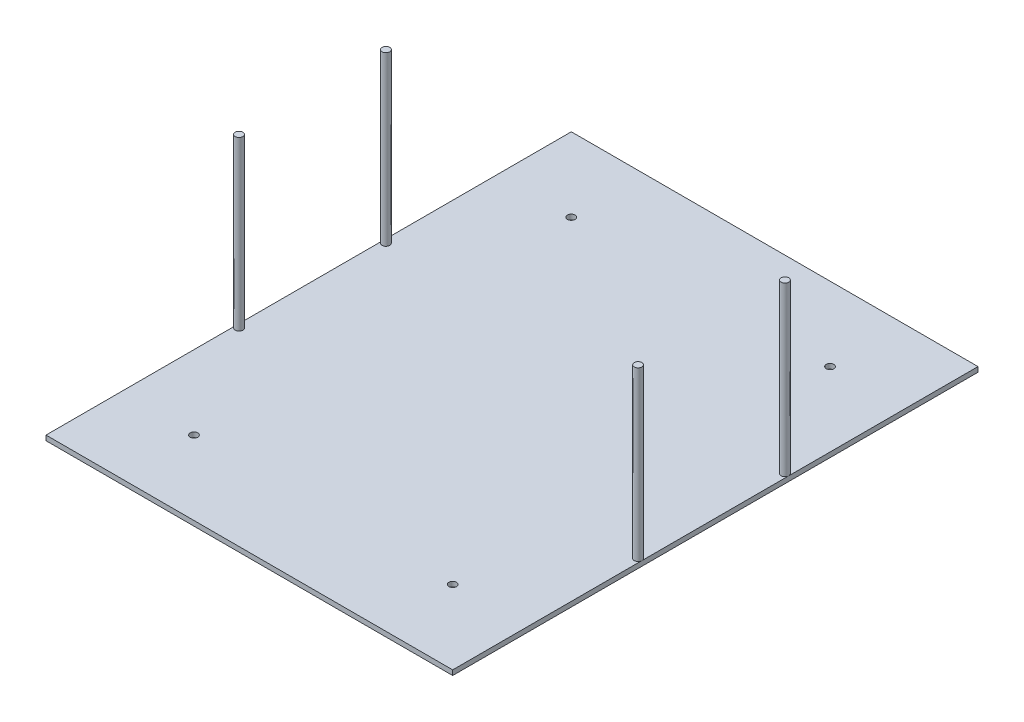
ISO-10303-21;
HEADER;
FILE_DESCRIPTION(('STEP AP214'),'2;1');
FILE_NAME('part.step','',(''),(''),'','','');
FILE_SCHEMA(('AUTOMOTIVE_DESIGN { 1 0 10303 214 1 1 1 1 }'));
ENDSEC;
DATA;
#1=APPLICATION_CONTEXT('core data for automotive mechanical design processes');
#2=APPLICATION_PROTOCOL_DEFINITION('international standard','automotive_design',2000,#1);
#3=PRODUCT_CONTEXT('',#1,'mechanical');
#4=PRODUCT('Part','Part','',(#3));
#5=PRODUCT_RELATED_PRODUCT_CATEGORY('part','',(#4));
#6=PRODUCT_DEFINITION_FORMATION('','',#4);
#7=PRODUCT_DEFINITION_CONTEXT('part definition',#1,'design');
#8=PRODUCT_DEFINITION('design','',#6,#7);
#9=PRODUCT_DEFINITION_SHAPE('','',#8);
#10=(LENGTH_UNIT() NAMED_UNIT(*) SI_UNIT(.MILLI.,.METRE.));
#11=(NAMED_UNIT(*) PLANE_ANGLE_UNIT() SI_UNIT($,.RADIAN.));
#12=(NAMED_UNIT(*) SI_UNIT($,.STERADIAN.) SOLID_ANGLE_UNIT());
#13=UNCERTAINTY_MEASURE_WITH_UNIT(LENGTH_MEASURE(1.E-05),#10,'distance_accuracy_value','');
#14=(GEOMETRIC_REPRESENTATION_CONTEXT(3) GLOBAL_UNCERTAINTY_ASSIGNED_CONTEXT((#13)) GLOBAL_UNIT_ASSIGNED_CONTEXT((#10,
#11,#12)) REPRESENTATION_CONTEXT('',''));
#15=CARTESIAN_POINT('',(0.,0.,0.));
#16=DIRECTION('',(0.,0.,1.));
#17=DIRECTION('',(1.,0.,0.));
#18=AXIS2_PLACEMENT_3D('',#15,#16,#17);
#19=CARTESIAN_POINT('',(-80.9,70.,-29.78));
#20=DIRECTION('',(0.,-1.,0.));
#21=DIRECTION('',(0.,0.,-1.));
#22=AXIS2_PLACEMENT_3D('',#19,#20,#21);
#23=CYLINDRICAL_SURFACE('',#22,1.54999999999999);
#24=CARTESIAN_POINT('',(-80.9,70.,-29.78));
#25=DIRECTION('',(0.,1.,0.));
#26=DIRECTION('',(0.,0.,1.));
#27=AXIS2_PLACEMENT_3D('',#24,#25,#26);
#28=CIRCLE('',#27,1.54999999999999);
#29=CARTESIAN_POINT('',(-80.9,70.,-28.23));
#30=VERTEX_POINT('',#29);
#31=EDGE_CURVE('E47',#30,#30,#28,.T.);
#32=ORIENTED_EDGE('',*,*,#31,.F.);
#33=EDGE_LOOP('',(#32));
#34=FACE_BOUND('',#33,.T.);
#35=CARTESIAN_POINT('',(-80.9,2.,-29.78));
#36=DIRECTION('',(0.,-1.,0.));
#37=DIRECTION('',(0.,0.,-1.));
#38=AXIS2_PLACEMENT_3D('',#35,#36,#37);
#39=CIRCLE('',#38,1.54999999999999);
#40=CARTESIAN_POINT('',(-82.45,2.,-29.78));
#41=VERTEX_POINT('',#40);
#42=EDGE_CURVE('E11',#41,#41,#39,.T.);
#43=ORIENTED_EDGE('',*,*,#42,.F.);
#44=EDGE_LOOP('',(#43));
#45=FACE_BOUND('',#44,.T.);
#46=ADVANCED_FACE('F38',(#34,#45),#23,.T.);
#47=CARTESIAN_POINT('',(-80.9,70.,-29.78));
#48=DIRECTION('',(0.,1.,0.));
#49=DIRECTION('',(0.,0.,1.));
#50=AXIS2_PLACEMENT_3D('',#47,#48,#49);
#51=PLANE('',#50);
#52=ORIENTED_EDGE('',*,*,#31,.T.);
#53=EDGE_LOOP('',(#52));
#54=FACE_BOUND('',#53,.T.);
#55=ADVANCED_FACE('F226',(#54),#51,.T.);
#56=CARTESIAN_POINT('',(-82.45,2.,106.5));
#57=DIRECTION('',(1.,0.,0.));
#58=DIRECTION('',(0.,0.,-1.));
#59=AXIS2_PLACEMENT_3D('',#56,#57,#58);
#60=PLANE('',#59);
#61=DIRECTION('',(0.,0.,1.));
#62=VECTOR('',#61,1.);
#63=CARTESIAN_POINT('',(-82.45,0.,106.5));
#64=LINE('',#63,#62);
#65=CARTESIAN_POINT('',(-82.45,0.,-106.5));
#66=VERTEX_POINT('',#65);
#67=CARTESIAN_POINT('',(-82.45,0.,106.5));
#68=VERTEX_POINT('',#67);
#69=EDGE_CURVE('E134',#66,#68,#64,.T.);
#70=ORIENTED_EDGE('',*,*,#69,.T.);
#71=DIRECTION('',(0.,-1.,0.));
#72=VECTOR('',#71,1.);
#73=CARTESIAN_POINT('',(-82.45,2.,106.5));
#74=LINE('',#73,#72);
#75=CARTESIAN_POINT('',(-82.45,2.,106.5));
#76=VERTEX_POINT('',#75);
#77=EDGE_CURVE('E141',#76,#68,#74,.T.);
#78=ORIENTED_EDGE('',*,*,#77,.F.);
#79=DIRECTION('',(0.,0.,1.));
#80=VECTOR('',#79,1.);
#81=CARTESIAN_POINT('',(-82.45,2.,106.5));
#82=LINE('',#81,#80);
#83=CARTESIAN_POINT('',(-82.45,2.,29.78));
#84=VERTEX_POINT('',#83);
#85=EDGE_CURVE('E118',#84,#76,#82,.T.);
#86=ORIENTED_EDGE('',*,*,#85,.F.);
#87=EDGE_CURVE('E123',#41,#84,#82,.T.);
#88=ORIENTED_EDGE('',*,*,#87,.F.);
#89=CARTESIAN_POINT('',(-82.45,2.,-106.5));
#90=VERTEX_POINT('',#89);
#91=EDGE_CURVE('E119',#90,#41,#82,.T.);
#92=ORIENTED_EDGE('',*,*,#91,.F.);
#93=DIRECTION('',(0.,-1.,0.));
#94=VECTOR('',#93,1.);
#95=CARTESIAN_POINT('',(-82.45,2.,-106.5));
#96=LINE('',#95,#94);
#97=EDGE_CURVE('E144',#90,#66,#96,.T.);
#98=ORIENTED_EDGE('',*,*,#97,.T.);
#99=EDGE_LOOP('',(#70,#78,#86,#88,#92,#98));
#100=FACE_BOUND('',#99,.T.);
#101=ADVANCED_FACE('F206',(#100),#60,.F.);
#102=CARTESIAN_POINT('',(82.45,2.,106.5));
#103=DIRECTION('',(-1.,0.,0.));
#104=DIRECTION('',(0.,0.,1.));
#105=AXIS2_PLACEMENT_3D('',#102,#103,#104);
#106=PLANE('',#105);
#107=DIRECTION('',(0.,0.,-1.));
#108=VECTOR('',#107,1.);
#109=CARTESIAN_POINT('',(82.45,0.,106.5));
#110=LINE('',#109,#108);
#111=CARTESIAN_POINT('',(82.45,0.,106.5));
#112=VERTEX_POINT('',#111);
#113=CARTESIAN_POINT('',(82.45,0.,-106.5));
#114=VERTEX_POINT('',#113);
#115=EDGE_CURVE('E127',#112,#114,#110,.T.);
#116=ORIENTED_EDGE('',*,*,#115,.T.);
#117=DIRECTION('',(0.,-1.,0.));
#118=VECTOR('',#117,1.);
#119=CARTESIAN_POINT('',(82.45,2.,-106.5));
#120=LINE('',#119,#118);
#121=CARTESIAN_POINT('',(82.45,2.,-106.5));
#122=VERTEX_POINT('',#121);
#123=EDGE_CURVE('E148',#122,#114,#120,.T.);
#124=ORIENTED_EDGE('',*,*,#123,.F.);
#125=DIRECTION('',(0.,0.,-1.));
#126=VECTOR('',#125,1.);
#127=CARTESIAN_POINT('',(82.45,2.,106.5));
#128=LINE('',#127,#126);
#129=CARTESIAN_POINT('',(82.45,2.,-29.78));
#130=VERTEX_POINT('',#129);
#131=EDGE_CURVE('E87',#130,#122,#128,.T.);
#132=ORIENTED_EDGE('',*,*,#131,.F.);
#133=CARTESIAN_POINT('',(82.45,2.,29.78));
#134=VERTEX_POINT('',#133);
#135=EDGE_CURVE('E106',#134,#130,#128,.T.);
#136=ORIENTED_EDGE('',*,*,#135,.F.);
#137=CARTESIAN_POINT('',(82.45,2.,106.5));
#138=VERTEX_POINT('',#137);
#139=EDGE_CURVE('E98',#138,#134,#128,.T.);
#140=ORIENTED_EDGE('',*,*,#139,.F.);
#141=DIRECTION('',(0.,-1.,0.));
#142=VECTOR('',#141,1.);
#143=CARTESIAN_POINT('',(82.45,2.,106.5));
#144=LINE('',#143,#142);
#145=EDGE_CURVE('E126',#138,#112,#144,.T.);
#146=ORIENTED_EDGE('',*,*,#145,.T.);
#147=EDGE_LOOP('',(#116,#124,#132,#136,#140,#146));
#148=FACE_BOUND('',#147,.T.);
#149=ADVANCED_FACE('F108',(#148),#106,.F.);
#150=CARTESIAN_POINT('',(-82.45,2.,-106.5));
#151=DIRECTION('',(0.,0.,1.));
#152=DIRECTION('',(1.,0.,0.));
#153=AXIS2_PLACEMENT_3D('',#150,#151,#152);
#154=PLANE('',#153);
#155=DIRECTION('',(-1.,0.,0.));
#156=VECTOR('',#155,1.);
#157=CARTESIAN_POINT('',(-82.45,0.,-106.5));
#158=LINE('',#157,#156);
#159=EDGE_CURVE('E130',#114,#66,#158,.T.);
#160=ORIENTED_EDGE('',*,*,#159,.T.);
#161=ORIENTED_EDGE('',*,*,#97,.F.);
#162=DIRECTION('',(-1.,0.,0.));
#163=VECTOR('',#162,1.);
#164=CARTESIAN_POINT('',(-82.45,2.,-106.5));
#165=LINE('',#164,#163);
#166=EDGE_CURVE('E105',#122,#90,#165,.T.);
#167=ORIENTED_EDGE('',*,*,#166,.F.);
#168=ORIENTED_EDGE('',*,*,#123,.T.);
#169=EDGE_LOOP('',(#160,#161,#167,#168));
#170=FACE_BOUND('',#169,.T.);
#171=ADVANCED_FACE('F215',(#170),#154,.F.);
#172=CARTESIAN_POINT('',(-82.45,2.,106.5));
#173=DIRECTION('',(0.,0.,-1.));
#174=DIRECTION('',(-1.,0.,0.));
#175=AXIS2_PLACEMENT_3D('',#172,#173,#174);
#176=PLANE('',#175);
#177=DIRECTION('',(1.,0.,0.));
#178=VECTOR('',#177,1.);
#179=CARTESIAN_POINT('',(-82.45,0.,106.5));
#180=LINE('',#179,#178);
#181=EDGE_CURVE('E80',#68,#112,#180,.T.);
#182=ORIENTED_EDGE('',*,*,#181,.T.);
#183=ORIENTED_EDGE('',*,*,#145,.F.);
#184=DIRECTION('',(1.,0.,0.));
#185=VECTOR('',#184,1.);
#186=CARTESIAN_POINT('',(-82.45,2.,106.5));
#187=LINE('',#186,#185);
#188=EDGE_CURVE('E59',#76,#138,#187,.T.);
#189=ORIENTED_EDGE('',*,*,#188,.F.);
#190=ORIENTED_EDGE('',*,*,#77,.T.);
#191=EDGE_LOOP('',(#182,#183,#189,#190));
#192=FACE_BOUND('',#191,.T.);
#193=ADVANCED_FACE('F208',(#192),#176,.F.);
#194=CARTESIAN_POINT('',(0.,2.,0.));
#195=DIRECTION('',(0.,-1.,0.));
#196=DIRECTION('',(0.,0.,-1.));
#197=AXIS2_PLACEMENT_3D('',#194,#195,#196);
#198=PLANE('',#197);
#199=CARTESIAN_POINT('',(-52.45,2.,76.5));
#200=DIRECTION('',(0.,1.,0.));
#201=DIRECTION('',(0.,0.,-1.));
#202=AXIS2_PLACEMENT_3D('',#199,#200,#201);
#203=CIRCLE('',#202,1.54999999999999);
#204=CARTESIAN_POINT('',(-52.45,2.,74.95));
#205=VERTEX_POINT('',#204);
#206=EDGE_CURVE('E356',#205,#205,#203,.T.);
#207=ORIENTED_EDGE('',*,*,#206,.F.);
#208=EDGE_LOOP('',(#207));
#209=FACE_BOUND('',#208,.T.);
#210=CARTESIAN_POINT('',(52.45,2.,76.5));
#211=DIRECTION('',(0.,1.,0.));
#212=DIRECTION('',(0.,0.,-1.));
#213=AXIS2_PLACEMENT_3D('',#210,#211,#212);
#214=CIRCLE('',#213,1.54999999999999);
#215=CARTESIAN_POINT('',(52.45,2.,74.95));
#216=VERTEX_POINT('',#215);
#217=EDGE_CURVE('E358',#216,#216,#214,.T.);
#218=ORIENTED_EDGE('',*,*,#217,.F.);
#219=EDGE_LOOP('',(#218));
#220=FACE_BOUND('',#219,.T.);
#221=CARTESIAN_POINT('',(52.45,2.,-76.5));
#222=DIRECTION('',(0.,1.,0.));
#223=DIRECTION('',(0.,0.,1.));
#224=AXIS2_PLACEMENT_3D('',#221,#222,#223);
#225=CIRCLE('',#224,1.54999999999999);
#226=CARTESIAN_POINT('',(52.45,2.,-74.95));
#227=VERTEX_POINT('',#226);
#228=EDGE_CURVE('E361',#227,#227,#225,.T.);
#229=ORIENTED_EDGE('',*,*,#228,.F.);
#230=EDGE_LOOP('',(#229));
#231=FACE_BOUND('',#230,.T.);
#232=CARTESIAN_POINT('',(-52.45,2.,-76.5));
#233=DIRECTION('',(0.,1.,0.));
#234=DIRECTION('',(0.,0.,1.));
#235=AXIS2_PLACEMENT_3D('',#232,#233,#234);
#236=CIRCLE('',#235,1.54999999999999);
#237=CARTESIAN_POINT('',(-52.45,2.,-74.95));
#238=VERTEX_POINT('',#237);
#239=EDGE_CURVE('E160',#238,#238,#236,.T.);
#240=ORIENTED_EDGE('',*,*,#239,.F.);
#241=EDGE_LOOP('',(#240));
#242=FACE_BOUND('',#241,.T.);
#243=ORIENTED_EDGE('',*,*,#139,.T.);
#244=CARTESIAN_POINT('',(80.9,2.,29.78));
#245=DIRECTION('',(0.,-1.,0.));
#246=DIRECTION('',(0.,0.,-1.));
#247=AXIS2_PLACEMENT_3D('',#244,#245,#246);
#248=CIRCLE('',#247,1.54999999999999);
#249=EDGE_CURVE('E102',#134,#134,#248,.F.);
#250=ORIENTED_EDGE('',*,*,#249,.F.);
#251=ORIENTED_EDGE('',*,*,#135,.T.);
#252=CARTESIAN_POINT('',(80.9,2.,-29.78));
#253=DIRECTION('',(0.,-1.,0.));
#254=DIRECTION('',(0.,0.,-1.));
#255=AXIS2_PLACEMENT_3D('',#252,#253,#254);
#256=CIRCLE('',#255,1.54999999999999);
#257=EDGE_CURVE('E187',#130,#130,#256,.F.);
#258=ORIENTED_EDGE('',*,*,#257,.F.);
#259=ORIENTED_EDGE('',*,*,#131,.T.);
#260=ORIENTED_EDGE('',*,*,#166,.T.);
#261=ORIENTED_EDGE('',*,*,#91,.T.);
#262=ORIENTED_EDGE('',*,*,#42,.T.);
#263=ORIENTED_EDGE('',*,*,#87,.T.);
#264=CARTESIAN_POINT('',(-80.9,2.,29.78));
#265=DIRECTION('',(0.,-1.,0.));
#266=DIRECTION('',(0.,0.,-1.));
#267=AXIS2_PLACEMENT_3D('',#264,#265,#266);
#268=CIRCLE('',#267,1.54999999999999);
#269=EDGE_CURVE('E114',#84,#84,#268,.F.);
#270=ORIENTED_EDGE('',*,*,#269,.F.);
#271=ORIENTED_EDGE('',*,*,#85,.T.);
#272=ORIENTED_EDGE('',*,*,#188,.T.);
#273=EDGE_LOOP('',(#243,#250,#251,#258,#259,#260,#261,#262,#263,#270,#271,#272));
#274=FACE_BOUND('',#273,.T.);
#275=ADVANCED_FACE('F100',(#209,#220,#231,#242,#274),#198,.F.);
#276=CARTESIAN_POINT('',(-80.9,0.,-29.78));
#277=DIRECTION('',(0.,1.,0.));
#278=DIRECTION('',(0.,0.,1.));
#279=AXIS2_PLACEMENT_3D('',#276,#277,#278);
#280=PLANE('',#279);
#281=CARTESIAN_POINT('',(-52.45,0.,76.5));
#282=DIRECTION('',(0.,1.,0.));
#283=DIRECTION('',(0.,0.,1.));
#284=AXIS2_PLACEMENT_3D('',#281,#282,#283);
#285=CIRCLE('',#284,1.54999999999999);
#286=CARTESIAN_POINT('',(-52.45,0.,78.05));
#287=VERTEX_POINT('',#286);
#288=EDGE_CURVE('E41',#287,#287,#285,.T.);
#289=ORIENTED_EDGE('',*,*,#288,.T.);
#290=EDGE_LOOP('',(#289));
#291=FACE_BOUND('',#290,.T.);
#292=CARTESIAN_POINT('',(52.45,0.,76.5));
#293=DIRECTION('',(0.,1.,0.));
#294=DIRECTION('',(0.,0.,1.));
#295=AXIS2_PLACEMENT_3D('',#292,#293,#294);
#296=CIRCLE('',#295,1.54999999999999);
#297=CARTESIAN_POINT('',(52.45,0.,78.05));
#298=VERTEX_POINT('',#297);
#299=EDGE_CURVE('E163',#298,#298,#296,.T.);
#300=ORIENTED_EDGE('',*,*,#299,.T.);
#301=EDGE_LOOP('',(#300));
#302=FACE_BOUND('',#301,.T.);
#303=CARTESIAN_POINT('',(52.45,0.,-76.5));
#304=DIRECTION('',(0.,1.,0.));
#305=DIRECTION('',(0.,0.,1.));
#306=AXIS2_PLACEMENT_3D('',#303,#304,#305);
#307=CIRCLE('',#306,1.54999999999999);
#308=CARTESIAN_POINT('',(52.45,0.,-74.95));
#309=VERTEX_POINT('',#308);
#310=EDGE_CURVE('E159',#309,#309,#307,.T.);
#311=ORIENTED_EDGE('',*,*,#310,.T.);
#312=EDGE_LOOP('',(#311));
#313=FACE_BOUND('',#312,.T.);
#314=CARTESIAN_POINT('',(-52.45,0.,-76.5));
#315=DIRECTION('',(0.,1.,0.));
#316=DIRECTION('',(0.,0.,1.));
#317=AXIS2_PLACEMENT_3D('',#314,#315,#316);
#318=CIRCLE('',#317,1.54999999999999);
#319=CARTESIAN_POINT('',(-52.45,0.,-74.95));
#320=VERTEX_POINT('',#319);
#321=EDGE_CURVE('E155',#320,#320,#318,.T.);
#322=ORIENTED_EDGE('',*,*,#321,.T.);
#323=EDGE_LOOP('',(#322));
#324=FACE_BOUND('',#323,.T.);
#325=ORIENTED_EDGE('',*,*,#159,.F.);
#326=ORIENTED_EDGE('',*,*,#115,.F.);
#327=ORIENTED_EDGE('',*,*,#181,.F.);
#328=ORIENTED_EDGE('',*,*,#69,.F.);
#329=EDGE_LOOP('',(#325,#326,#327,#328));
#330=FACE_BOUND('',#329,.T.);
#331=ADVANCED_FACE('F212',(#291,#302,#313,#324,#330),#280,.F.);
#332=CARTESIAN_POINT('',(-80.9,70.,29.78));
#333=DIRECTION('',(0.,-1.,0.));
#334=DIRECTION('',(0.,0.,-1.));
#335=AXIS2_PLACEMENT_3D('',#332,#333,#334);
#336=CYLINDRICAL_SURFACE('',#335,1.54999999999999);
#337=CARTESIAN_POINT('',(-80.9,70.,29.78));
#338=DIRECTION('',(0.,1.,0.));
#339=DIRECTION('',(0.,0.,1.));
#340=AXIS2_PLACEMENT_3D('',#337,#338,#339);
#341=CIRCLE('',#340,1.54999999999999);
#342=CARTESIAN_POINT('',(-80.9,70.,31.33));
#343=VERTEX_POINT('',#342);
#344=EDGE_CURVE('E190',#343,#343,#341,.T.);
#345=ORIENTED_EDGE('',*,*,#344,.F.);
#346=EDGE_LOOP('',(#345));
#347=FACE_BOUND('',#346,.T.);
#348=ORIENTED_EDGE('',*,*,#269,.T.);
#349=EDGE_LOOP('',(#348));
#350=FACE_BOUND('',#349,.T.);
#351=ADVANCED_FACE('F199',(#347,#350),#336,.T.);
#352=CARTESIAN_POINT('',(-80.9,70.,29.78));
#353=DIRECTION('',(0.,1.,0.));
#354=DIRECTION('',(0.,0.,1.));
#355=AXIS2_PLACEMENT_3D('',#352,#353,#354);
#356=PLANE('',#355);
#357=ORIENTED_EDGE('',*,*,#344,.T.);
#358=EDGE_LOOP('',(#357));
#359=FACE_BOUND('',#358,.T.);
#360=ADVANCED_FACE('F243',(#359),#356,.T.);
#361=CARTESIAN_POINT('',(80.9,70.,-29.78));
#362=DIRECTION('',(0.,-1.,0.));
#363=DIRECTION('',(0.,0.,-1.));
#364=AXIS2_PLACEMENT_3D('',#361,#362,#363);
#365=CYLINDRICAL_SURFACE('',#364,1.54999999999999);
#366=CARTESIAN_POINT('',(80.9,70.,-29.78));
#367=DIRECTION('',(0.,1.,0.));
#368=DIRECTION('',(0.,0.,1.));
#369=AXIS2_PLACEMENT_3D('',#366,#367,#368);
#370=CIRCLE('',#369,1.54999999999999);
#371=CARTESIAN_POINT('',(80.9,70.,-28.23));
#372=VERTEX_POINT('',#371);
#373=EDGE_CURVE('E179',#372,#372,#370,.T.);
#374=ORIENTED_EDGE('',*,*,#373,.F.);
#375=EDGE_LOOP('',(#374));
#376=FACE_BOUND('',#375,.T.);
#377=ORIENTED_EDGE('',*,*,#257,.T.);
#378=EDGE_LOOP('',(#377));
#379=FACE_BOUND('',#378,.T.);
#380=ADVANCED_FACE('F278',(#376,#379),#365,.T.);
#381=CARTESIAN_POINT('',(80.9,70.,-29.78));
#382=DIRECTION('',(0.,1.,0.));
#383=DIRECTION('',(0.,0.,1.));
#384=AXIS2_PLACEMENT_3D('',#381,#382,#383);
#385=PLANE('',#384);
#386=ORIENTED_EDGE('',*,*,#373,.T.);
#387=EDGE_LOOP('',(#386));
#388=FACE_BOUND('',#387,.T.);
#389=ADVANCED_FACE('F274',(#388),#385,.T.);
#390=CARTESIAN_POINT('',(80.9,70.,29.78));
#391=DIRECTION('',(0.,-1.,0.));
#392=DIRECTION('',(0.,0.,-1.));
#393=AXIS2_PLACEMENT_3D('',#390,#391,#392);
#394=CYLINDRICAL_SURFACE('',#393,1.54999999999999);
#395=CARTESIAN_POINT('',(80.9,70.,29.78));
#396=DIRECTION('',(0.,1.,0.));
#397=DIRECTION('',(0.,0.,1.));
#398=AXIS2_PLACEMENT_3D('',#395,#396,#397);
#399=CIRCLE('',#398,1.54999999999999);
#400=CARTESIAN_POINT('',(80.9,70.,31.33));
#401=VERTEX_POINT('',#400);
#402=EDGE_CURVE('E170',#401,#401,#399,.T.);
#403=ORIENTED_EDGE('',*,*,#402,.F.);
#404=EDGE_LOOP('',(#403));
#405=FACE_BOUND('',#404,.T.);
#406=ORIENTED_EDGE('',*,*,#249,.T.);
#407=EDGE_LOOP('',(#406));
#408=FACE_BOUND('',#407,.T.);
#409=ADVANCED_FACE('F265',(#405,#408),#394,.T.);
#410=CARTESIAN_POINT('',(80.9,70.,29.78));
#411=DIRECTION('',(0.,1.,0.));
#412=DIRECTION('',(0.,0.,1.));
#413=AXIS2_PLACEMENT_3D('',#410,#411,#412);
#414=PLANE('',#413);
#415=ORIENTED_EDGE('',*,*,#402,.T.);
#416=EDGE_LOOP('',(#415));
#417=FACE_BOUND('',#416,.T.);
#418=ADVANCED_FACE('F256',(#417),#414,.T.);
#419=CARTESIAN_POINT('',(-52.45,-8.,-76.5));
#420=DIRECTION('',(0.,1.,0.));
#421=DIRECTION('',(0.,0.,1.));
#422=AXIS2_PLACEMENT_3D('',#419,#420,#421);
#423=CYLINDRICAL_SURFACE('',#422,1.54999999999999);
#424=ORIENTED_EDGE('',*,*,#239,.T.);
#425=EDGE_LOOP('',(#424));
#426=FACE_BOUND('',#425,.T.);
#427=ORIENTED_EDGE('',*,*,#321,.F.);
#428=EDGE_LOOP('',(#427));
#429=FACE_BOUND('',#428,.T.);
#430=ADVANCED_FACE('F253',(#426,#429),#423,.F.);
#431=CARTESIAN_POINT('',(52.45,-8.,-76.5));
#432=DIRECTION('',(0.,1.,0.));
#433=DIRECTION('',(0.,0.,1.));
#434=AXIS2_PLACEMENT_3D('',#431,#432,#433);
#435=CYLINDRICAL_SURFACE('',#434,1.54999999999999);
#436=ORIENTED_EDGE('',*,*,#228,.T.);
#437=EDGE_LOOP('',(#436));
#438=FACE_BOUND('',#437,.T.);
#439=ORIENTED_EDGE('',*,*,#310,.F.);
#440=EDGE_LOOP('',(#439));
#441=FACE_BOUND('',#440,.T.);
#442=ADVANCED_FACE('F255',(#438,#441),#435,.F.);
#443=CARTESIAN_POINT('',(52.45,-8.,76.5));
#444=DIRECTION('',(0.,1.,0.));
#445=DIRECTION('',(0.,0.,1.));
#446=AXIS2_PLACEMENT_3D('',#443,#444,#445);
#447=CYLINDRICAL_SURFACE('',#446,1.54999999999999);
#448=ORIENTED_EDGE('',*,*,#217,.T.);
#449=EDGE_LOOP('',(#448));
#450=FACE_BOUND('',#449,.T.);
#451=ORIENTED_EDGE('',*,*,#299,.F.);
#452=EDGE_LOOP('',(#451));
#453=FACE_BOUND('',#452,.T.);
#454=ADVANCED_FACE('F262',(#450,#453),#447,.F.);
#455=CARTESIAN_POINT('',(-52.45,-8.,76.5));
#456=DIRECTION('',(0.,1.,0.));
#457=DIRECTION('',(0.,0.,1.));
#458=AXIS2_PLACEMENT_3D('',#455,#456,#457);
#459=CYLINDRICAL_SURFACE('',#458,1.54999999999999);
#460=ORIENTED_EDGE('',*,*,#206,.T.);
#461=EDGE_LOOP('',(#460));
#462=FACE_BOUND('',#461,.T.);
#463=ORIENTED_EDGE('',*,*,#288,.F.);
#464=EDGE_LOOP('',(#463));
#465=FACE_BOUND('',#464,.T.);
#466=ADVANCED_FACE('F269',(#462,#465),#459,.F.);
#467=CLOSED_SHELL('',(#46,#55,#101,#149,#171,#193,#275,#331,#351,#360,#380,#389,#409,#418,#430,
#442,#454,#466));
#468=MANIFOLD_SOLID_BREP('B2',#467);
#469=ADVANCED_BREP_SHAPE_REPRESENTATION('',(#18,#468),#14);
#470=SHAPE_DEFINITION_REPRESENTATION(#9,#469);
ENDSEC;
END-ISO-10303-21;
